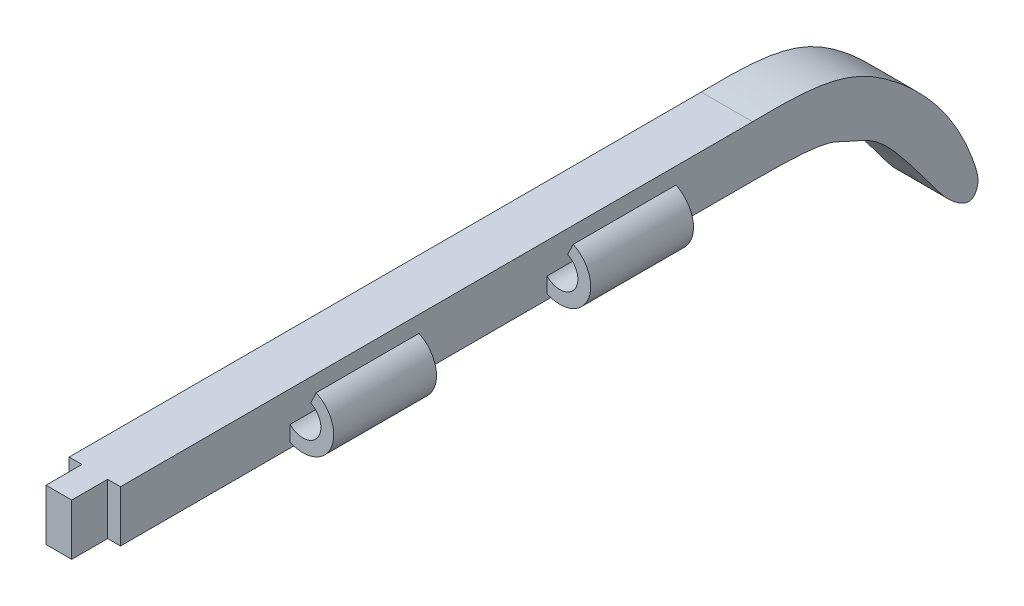
ISO-10303-21;
HEADER;
FILE_DESCRIPTION(('STEP AP214'),'2;1');
FILE_NAME('part.step','',(''),(''),'','','');
FILE_SCHEMA(('AUTOMOTIVE_DESIGN { 1 0 10303 214 1 1 1 1 }'));
ENDSEC;
DATA;
#1=APPLICATION_CONTEXT('core data for automotive mechanical design processes');
#2=APPLICATION_PROTOCOL_DEFINITION('international standard','automotive_design',2000,#1);
#3=PRODUCT_CONTEXT('',#1,'mechanical');
#4=PRODUCT('Part','Part','',(#3));
#5=PRODUCT_RELATED_PRODUCT_CATEGORY('part','',(#4));
#6=PRODUCT_DEFINITION_FORMATION('','',#4);
#7=PRODUCT_DEFINITION_CONTEXT('part definition',#1,'design');
#8=PRODUCT_DEFINITION('design','',#6,#7);
#9=PRODUCT_DEFINITION_SHAPE('','',#8);
#10=(LENGTH_UNIT() NAMED_UNIT(*) SI_UNIT(.MILLI.,.METRE.));
#11=(NAMED_UNIT(*) PLANE_ANGLE_UNIT() SI_UNIT($,.RADIAN.));
#12=(NAMED_UNIT(*) SI_UNIT($,.STERADIAN.) SOLID_ANGLE_UNIT());
#13=UNCERTAINTY_MEASURE_WITH_UNIT(LENGTH_MEASURE(1.E-05),#10,'distance_accuracy_value','');
#14=(GEOMETRIC_REPRESENTATION_CONTEXT(3) GLOBAL_UNCERTAINTY_ASSIGNED_CONTEXT((#13)) GLOBAL_UNIT_ASSIGNED_CONTEXT((#10,
#11,#12)) REPRESENTATION_CONTEXT('',''));
#15=CARTESIAN_POINT('',(0.,0.,0.));
#16=DIRECTION('',(0.,0.,1.));
#17=DIRECTION('',(1.,0.,0.));
#18=AXIS2_PLACEMENT_3D('',#15,#16,#17);
#19=CARTESIAN_POINT('',(10.,-6.42982879689128,-155.300887230622));
#20=DIRECTION('',(1.,0.,0.));
#21=DIRECTION('',(0.,0.,-1.));
#22=AXIS2_PLACEMENT_3D('',#19,#20,#21);
#23=PLANE('',#22);
#24=DIRECTION('',(0.,0.,1.));
#25=VECTOR('',#24,1.);
#26=CARTESIAN_POINT('',(10.,4.,-60.));
#27=LINE('',#26,#25);
#28=CARTESIAN_POINT('',(10.,4.,-60.));
#29=VERTEX_POINT('',#28);
#30=CARTESIAN_POINT('',(10.,4.,-40.));
#31=VERTEX_POINT('',#30);
#32=EDGE_CURVE('E269',#29,#31,#27,.T.);
#33=ORIENTED_EDGE('',*,*,#32,.F.);
#34=DIRECTION('',(0.,1.,0.));
#35=VECTOR('',#34,1.);
#36=CARTESIAN_POINT('',(10.,0.,-60.));
#37=LINE('',#36,#35);
#38=CARTESIAN_POINT('',(10.,0.999999999999999,-60.));
#39=VERTEX_POINT('',#38);
#40=EDGE_CURVE('E256',#39,#29,#37,.T.);
#41=ORIENTED_EDGE('',*,*,#40,.F.);
#42=DIRECTION('',(0.,0.,1.));
#43=VECTOR('',#42,1.);
#44=CARTESIAN_POINT('',(10.,0.999999999999999,-60.));
#45=LINE('',#44,#43);
#46=CARTESIAN_POINT('',(10.,0.999999999999999,-40.));
#47=VERTEX_POINT('',#46);
#48=EDGE_CURVE('E290',#39,#47,#45,.T.);
#49=ORIENTED_EDGE('',*,*,#48,.T.);
#50=DIRECTION('',(0.,1.,0.));
#51=VECTOR('',#50,1.);
#52=CARTESIAN_POINT('',(10.,0.,-40.));
#53=LINE('',#52,#51);
#54=EDGE_CURVE('E273',#47,#31,#53,.T.);
#55=ORIENTED_EDGE('',*,*,#54,.T.);
#56=EDGE_LOOP('',(#33,#41,#49,#55));
#57=FACE_BOUND('',#56,.T.);
#58=DIRECTION('',(0.,0.,-1.));
#59=VECTOR('',#58,1.);
#60=CARTESIAN_POINT('',(10.,0.999999999999999,-90.));
#61=LINE('',#60,#59);
#62=CARTESIAN_POINT('',(10.,0.999999999999999,-90.));
#63=VERTEX_POINT('',#62);
#64=CARTESIAN_POINT('',(10.,0.999999999999999,-110.));
#65=VERTEX_POINT('',#64);
#66=EDGE_CURVE('E243',#63,#65,#61,.T.);
#67=ORIENTED_EDGE('',*,*,#66,.F.);
#68=DIRECTION('',(0.,1.,0.));
#69=VECTOR('',#68,1.);
#70=CARTESIAN_POINT('',(10.,0.,-90.));
#71=LINE('',#70,#69);
#72=CARTESIAN_POINT('',(10.,4.,-90.));
#73=VERTEX_POINT('',#72);
#74=EDGE_CURVE('E222',#63,#73,#71,.T.);
#75=ORIENTED_EDGE('',*,*,#74,.T.);
#76=DIRECTION('',(0.,0.,-1.));
#77=VECTOR('',#76,1.);
#78=CARTESIAN_POINT('',(10.,4.,-90.));
#79=LINE('',#78,#77);
#80=CARTESIAN_POINT('',(10.,4.,-110.));
#81=VERTEX_POINT('',#80);
#82=EDGE_CURVE('E239',#73,#81,#79,.T.);
#83=ORIENTED_EDGE('',*,*,#82,.T.);
#84=DIRECTION('',(0.,1.,0.));
#85=VECTOR('',#84,1.);
#86=CARTESIAN_POINT('',(10.,0.,-110.));
#87=LINE('',#86,#85);
#88=EDGE_CURVE('E216',#65,#81,#87,.T.);
#89=ORIENTED_EDGE('',*,*,#88,.F.);
#90=EDGE_LOOP('',(#67,#75,#83,#89));
#91=FACE_BOUND('',#90,.T.);
#92=DIRECTION('',(0.,0.,-1.));
#93=VECTOR('',#92,1.);
#94=CARTESIAN_POINT('',(10.,9.99999999999996,0.));
#95=LINE('',#94,#93);
#96=CARTESIAN_POINT('',(10.,9.99999999999996,-7.));
#97=VERTEX_POINT('',#96);
#98=CARTESIAN_POINT('',(10.,9.99999999999996,-130.));
#99=VERTEX_POINT('',#98);
#100=EDGE_CURVE('E296',#97,#99,#95,.T.);
#101=ORIENTED_EDGE('',*,*,#100,.F.);
#102=DIRECTION('',(0.,1.,0.));
#103=VECTOR('',#102,1.);
#104=CARTESIAN_POINT('',(10.,0.,-7.));
#105=LINE('',#104,#103);
#106=CARTESIAN_POINT('',(10.,0.,-7.));
#107=VERTEX_POINT('',#106);
#108=EDGE_CURVE('E59',#107,#97,#105,.T.);
#109=ORIENTED_EDGE('',*,*,#108,.F.);
#110=DIRECTION('',(0.,0.,1.));
#111=VECTOR('',#110,1.);
#112=CARTESIAN_POINT('',(10.,0.,-130.));
#113=LINE('',#112,#111);
#114=CARTESIAN_POINT('',(10.,0.,-130.));
#115=VERTEX_POINT('',#114);
#116=EDGE_CURVE('E307',#115,#107,#113,.T.);
#117=ORIENTED_EDGE('',*,*,#116,.F.);
#118=CARTESIAN_POINT('',(10.,9.99999999999997,-130.));
#119=CARTESIAN_POINT('',(10.,10.295968590931,-143.257831062412));
#120=CARTESIAN_POINT('',(10.,8.41133936852432,-152.362580677432));
#121=CARTESIAN_POINT('',(10.,-5.77334435383178,-167.478605766022));
#122=CARTESIAN_POINT('',(10.,-16.2820946464498,-172.615930833704));
#123=CARTESIAN_POINT('',(10.,-21.8732348199775,-174.074786886858));
#124=CARTESIAN_POINT('',(10.,-25.2750778877369,-172.857902226209));
#125=CARTESIAN_POINT('',(10.,-23.155195651103,-168.561594529484));
#126=CARTESIAN_POINT('',(10.,-7.44852186325274,-157.06153808889));
#127=CARTESIAN_POINT('',(10.,-5.12655605678584,-154.600537823708));
#128=CARTESIAN_POINT('',(10.,-1.23947524203274,-145.232328072717));
#129=CARTESIAN_POINT('',(10.,0.,-144.477420142203));
#130=CARTESIAN_POINT('',(10.,0.,-130.));
#131=B_SPLINE_CURVE_WITH_KNOTS('',3,(#118,#119,#120,#121,#122,#123,#124,#125,#126,#127,#128,
#129,#130),.UNSPECIFIED.,.F.,.F.,(4,1,1,1,1,1,1,1,1,1,4),(0.,0.101519052300562,
0.157910706506036,0.210541639800686,0.223356201787652,0.228060175251646,0.254301241197406,
0.299209561547706,0.632235058404343,0.706476920960281,1.),.UNSPECIFIED.);
#132=EDGE_CURVE('E299',#99,#115,#131,.T.);
#133=ORIENTED_EDGE('',*,*,#132,.F.);
#134=EDGE_LOOP('',(#101,#109,#117,#133));
#135=FACE_BOUND('',#134,.T.);
#136=ADVANCED_FACE('F41',(#57,#91,#135),#23,.T.);
#137=CARTESIAN_POINT('',(10.,0.,0.));
#138=DIRECTION('',(0.,0.,1.));
#139=DIRECTION('',(1.,0.,0.));
#140=AXIS2_PLACEMENT_3D('',#137,#138,#139);
#141=PLANE('',#140);
#142=DIRECTION('',(0.,-1.,0.));
#143=VECTOR('',#142,1.);
#144=CARTESIAN_POINT('',(7.5,0.,0.));
#145=LINE('',#144,#143);
#146=CARTESIAN_POINT('',(7.5,9.99999999999996,0.));
#147=VERTEX_POINT('',#146);
#148=CARTESIAN_POINT('',(7.5,0.,0.));
#149=VERTEX_POINT('',#148);
#150=EDGE_CURVE('E174',#147,#149,#145,.T.);
#151=ORIENTED_EDGE('',*,*,#150,.F.);
#152=DIRECTION('',(-1.,0.,0.));
#153=VECTOR('',#152,1.);
#154=CARTESIAN_POINT('',(10.,9.99999999999996,0.));
#155=LINE('',#154,#153);
#156=CARTESIAN_POINT('',(2.5,9.99999999999996,0.));
#157=VERTEX_POINT('',#156);
#158=EDGE_CURVE('E45',#147,#157,#155,.T.);
#159=ORIENTED_EDGE('',*,*,#158,.T.);
#160=DIRECTION('',(0.,-1.,0.));
#161=VECTOR('',#160,1.);
#162=CARTESIAN_POINT('',(2.5,0.,0.));
#163=LINE('',#162,#161);
#164=CARTESIAN_POINT('',(2.5,0.,0.));
#165=VERTEX_POINT('',#164);
#166=EDGE_CURVE('E192',#157,#165,#163,.T.);
#167=ORIENTED_EDGE('',*,*,#166,.T.);
#168=DIRECTION('',(-1.,0.,0.));
#169=VECTOR('',#168,1.);
#170=CARTESIAN_POINT('',(10.,0.,0.));
#171=LINE('',#170,#169);
#172=EDGE_CURVE('E11',#149,#165,#171,.T.);
#173=ORIENTED_EDGE('',*,*,#172,.F.);
#174=EDGE_LOOP('',(#151,#159,#167,#173));
#175=FACE_BOUND('',#174,.T.);
#176=ADVANCED_FACE('F43',(#175),#141,.T.);
#177=CARTESIAN_POINT('',(10.,0.,-130.));
#178=DIRECTION('',(0.,-1.,0.));
#179=DIRECTION('',(0.,0.,-1.));
#180=AXIS2_PLACEMENT_3D('',#177,#178,#179);
#181=PLANE('',#180);
#182=DIRECTION('',(0.,0.,1.));
#183=VECTOR('',#182,1.);
#184=CARTESIAN_POINT('',(7.5,0.,-7.));
#185=LINE('',#184,#183);
#186=CARTESIAN_POINT('',(7.5,0.,-7.));
#187=VERTEX_POINT('',#186);
#188=EDGE_CURVE('E164',#187,#149,#185,.T.);
#189=ORIENTED_EDGE('',*,*,#188,.T.);
#190=ORIENTED_EDGE('',*,*,#172,.T.);
#191=DIRECTION('',(0.,0.,1.));
#192=VECTOR('',#191,1.);
#193=CARTESIAN_POINT('',(2.5,0.,-7.));
#194=LINE('',#193,#192);
#195=CARTESIAN_POINT('',(2.5,0.,-7.));
#196=VERTEX_POINT('',#195);
#197=EDGE_CURVE('E206',#196,#165,#194,.T.);
#198=ORIENTED_EDGE('',*,*,#197,.F.);
#199=DIRECTION('',(1.,0.,0.));
#200=VECTOR('',#199,1.);
#201=CARTESIAN_POINT('',(0.,0.,-7.));
#202=LINE('',#201,#200);
#203=CARTESIAN_POINT('',(0.,0.,-7.));
#204=VERTEX_POINT('',#203);
#205=EDGE_CURVE('E198',#204,#196,#202,.T.);
#206=ORIENTED_EDGE('',*,*,#205,.F.);
#207=DIRECTION('',(0.,0.,1.));
#208=VECTOR('',#207,1.);
#209=CARTESIAN_POINT('',(0.,0.,-130.));
#210=LINE('',#209,#208);
#211=CARTESIAN_POINT('',(0.,0.,-130.));
#212=VERTEX_POINT('',#211);
#213=EDGE_CURVE('E300',#212,#204,#210,.T.);
#214=ORIENTED_EDGE('',*,*,#213,.F.);
#215=DIRECTION('',(-1.,0.,0.));
#216=VECTOR('',#215,1.);
#217=CARTESIAN_POINT('',(10.,0.,-130.));
#218=LINE('',#217,#216);
#219=EDGE_CURVE('E51',#115,#212,#218,.T.);
#220=ORIENTED_EDGE('',*,*,#219,.F.);
#221=ORIENTED_EDGE('',*,*,#116,.T.);
#222=DIRECTION('',(1.,0.,0.));
#223=VECTOR('',#222,1.);
#224=CARTESIAN_POINT('',(0.,0.,-7.));
#225=LINE('',#224,#223);
#226=EDGE_CURVE('E167',#187,#107,#225,.T.);
#227=ORIENTED_EDGE('',*,*,#226,.F.);
#228=EDGE_LOOP('',(#189,#190,#198,#206,#214,#220,#221,#227));
#229=FACE_BOUND('',#228,.T.);
#230=ADVANCED_FACE('F319',(#229),#181,.T.);
#231=CARTESIAN_POINT('',(10.,9.99999999999996,0.));
#232=DIRECTION('',(0.,1.,0.));
#233=DIRECTION('',(0.,0.,1.));
#234=AXIS2_PLACEMENT_3D('',#231,#232,#233);
#235=PLANE('',#234);
#236=DIRECTION('',(0.,0.,1.));
#237=VECTOR('',#236,1.);
#238=CARTESIAN_POINT('',(7.5,9.99999999999996,-7.));
#239=LINE('',#238,#237);
#240=CARTESIAN_POINT('',(7.5,9.99999999999996,-7.));
#241=VERTEX_POINT('',#240);
#242=EDGE_CURVE('E161',#241,#147,#239,.T.);
#243=ORIENTED_EDGE('',*,*,#242,.F.);
#244=DIRECTION('',(-1.,0.,0.));
#245=VECTOR('',#244,1.);
#246=CARTESIAN_POINT('',(0.,9.99999999999996,-7.));
#247=LINE('',#246,#245);
#248=EDGE_CURVE('E168',#97,#241,#247,.T.);
#249=ORIENTED_EDGE('',*,*,#248,.F.);
#250=ORIENTED_EDGE('',*,*,#100,.T.);
#251=DIRECTION('',(-1.,0.,0.));
#252=VECTOR('',#251,1.);
#253=CARTESIAN_POINT('',(10.,9.99999999999996,-130.));
#254=LINE('',#253,#252);
#255=CARTESIAN_POINT('',(0.,9.99999999999996,-130.));
#256=VERTEX_POINT('',#255);
#257=EDGE_CURVE('E513',#99,#256,#254,.T.);
#258=ORIENTED_EDGE('',*,*,#257,.T.);
#259=DIRECTION('',(0.,0.,-1.));
#260=VECTOR('',#259,1.);
#261=CARTESIAN_POINT('',(0.,9.99999999999996,0.));
#262=LINE('',#261,#260);
#263=CARTESIAN_POINT('',(0.,9.99999999999996,-7.00000000000001));
#264=VERTEX_POINT('',#263);
#265=EDGE_CURVE('E286',#264,#256,#262,.T.);
#266=ORIENTED_EDGE('',*,*,#265,.F.);
#267=DIRECTION('',(-1.,0.,0.));
#268=VECTOR('',#267,1.);
#269=CARTESIAN_POINT('',(0.,9.99999999999996,-7.));
#270=LINE('',#269,#268);
#271=CARTESIAN_POINT('',(2.5,9.99999999999996,-7.));
#272=VERTEX_POINT('',#271);
#273=EDGE_CURVE('E67',#272,#264,#270,.T.);
#274=ORIENTED_EDGE('',*,*,#273,.F.);
#275=DIRECTION('',(0.,0.,1.));
#276=VECTOR('',#275,1.);
#277=CARTESIAN_POINT('',(2.5,9.99999999999996,-7.));
#278=LINE('',#277,#276);
#279=EDGE_CURVE('E202',#272,#157,#278,.T.);
#280=ORIENTED_EDGE('',*,*,#279,.T.);
#281=ORIENTED_EDGE('',*,*,#158,.F.);
#282=EDGE_LOOP('',(#243,#249,#250,#258,#266,#274,#280,#281));
#283=FACE_BOUND('',#282,.T.);
#284=ADVANCED_FACE('F177',(#283),#235,.T.);
#285=CARTESIAN_POINT('',(0.,-6.42982879689128,-155.300887230622));
#286=DIRECTION('',(1.,0.,0.));
#287=DIRECTION('',(0.,0.,-1.));
#288=AXIS2_PLACEMENT_3D('',#285,#286,#287);
#289=PLANE('',#288);
#290=DIRECTION('',(0.,-1.,0.));
#291=VECTOR('',#290,1.);
#292=CARTESIAN_POINT('',(0.,0.,-7.));
#293=LINE('',#292,#291);
#294=EDGE_CURVE('E195',#264,#204,#293,.T.);
#295=ORIENTED_EDGE('',*,*,#294,.F.);
#296=ORIENTED_EDGE('',*,*,#265,.T.);
#297=CARTESIAN_POINT('',(0.,9.99999999999997,-130.));
#298=CARTESIAN_POINT('',(0.,10.295968590931,-143.257831062412));
#299=CARTESIAN_POINT('',(0.,8.41133936852432,-152.362580677432));
#300=CARTESIAN_POINT('',(0.,-5.77334435383178,-167.478605766022));
#301=CARTESIAN_POINT('',(0.,-16.2820946464498,-172.615930833704));
#302=CARTESIAN_POINT('',(0.,-21.8732348199775,-174.074786886858));
#303=CARTESIAN_POINT('',(0.,-25.2750778877369,-172.857902226209));
#304=CARTESIAN_POINT('',(0.,-23.155195651103,-168.561594529484));
#305=CARTESIAN_POINT('',(0.,-7.44852186325274,-157.06153808889));
#306=CARTESIAN_POINT('',(0.,-5.12655605678584,-154.600537823708));
#307=CARTESIAN_POINT('',(0.,-1.23947524203274,-145.232328072717));
#308=CARTESIAN_POINT('',(0.,0.,-144.477420142203));
#309=CARTESIAN_POINT('',(0.,0.,-130.));
#310=B_SPLINE_CURVE_WITH_KNOTS('',3,(#297,#298,#299,#300,#301,#302,#303,#304,#305,#306,#307,
#308,#309),.UNSPECIFIED.,.F.,.F.,(4,1,1,1,1,1,1,1,1,1,4),(0.,0.101519052300562,
0.157910706506036,0.210541639800686,0.223356201787652,0.228060175251646,0.254301241197406,
0.299209561547706,0.632235058404343,0.706476920960281,1.),.UNSPECIFIED.);
#311=EDGE_CURVE('E517',#256,#212,#310,.T.);
#312=ORIENTED_EDGE('',*,*,#311,.T.);
#313=ORIENTED_EDGE('',*,*,#213,.T.);
#314=EDGE_LOOP('',(#295,#296,#312,#313));
#315=FACE_BOUND('',#314,.T.);
#316=ADVANCED_FACE('F317',(#315),#289,.F.);
#317=DIRECTION('',(-1.,0.,0.));
#318=VECTOR('',#317,1.);
#319=SURFACE_OF_LINEAR_EXTRUSION('',#131,#318);
#320=ORIENTED_EDGE('',*,*,#311,.F.);
#321=ORIENTED_EDGE('',*,*,#257,.F.);
#322=ORIENTED_EDGE('',*,*,#132,.T.);
#323=ORIENTED_EDGE('',*,*,#219,.T.);
#324=EDGE_LOOP('',(#320,#321,#322,#323));
#325=FACE_BOUND('',#324,.T.);
#326=ADVANCED_FACE('F313',(#325),#319,.T.);
#327=CARTESIAN_POINT('',(12.4913043214795,6.45833333333333,-60.));
#328=DIRECTION('',(0.,0.,1.));
#329=DIRECTION('',(1.,0.,0.));
#330=AXIS2_PLACEMENT_3D('',#327,#328,#329);
#331=CYLINDRICAL_SURFACE('',#330,3.5);
#332=CARTESIAN_POINT('',(12.4913043214795,6.45833333333333,-40.));
#333=DIRECTION('',(0.,0.,1.));
#334=DIRECTION('',(1.,0.,0.));
#335=AXIS2_PLACEMENT_3D('',#332,#333,#334);
#336=CIRCLE('',#335,3.5);
#337=CARTESIAN_POINT('',(14.,9.61647160605247,-40.));
#338=VERTEX_POINT('',#337);
#339=EDGE_CURVE('E242',#31,#338,#336,.T.);
#340=ORIENTED_EDGE('',*,*,#339,.T.);
#341=DIRECTION('',(0.,0.,1.));
#342=VECTOR('',#341,1.);
#343=CARTESIAN_POINT('',(14.,9.61647160605247,-60.));
#344=LINE('',#343,#342);
#345=CARTESIAN_POINT('',(14.,9.61647160605247,-60.));
#346=VERTEX_POINT('',#345);
#347=EDGE_CURVE('E283',#346,#338,#344,.T.);
#348=ORIENTED_EDGE('',*,*,#347,.F.);
#349=CARTESIAN_POINT('',(12.4913043214795,6.45833333333333,-60.));
#350=DIRECTION('',(0.,0.,1.));
#351=DIRECTION('',(1.,0.,0.));
#352=AXIS2_PLACEMENT_3D('',#349,#350,#351);
#353=CIRCLE('',#352,3.5);
#354=EDGE_CURVE('E253',#29,#346,#353,.T.);
#355=ORIENTED_EDGE('',*,*,#354,.F.);
#356=ORIENTED_EDGE('',*,*,#32,.T.);
#357=EDGE_LOOP('',(#340,#348,#355,#356));
#358=FACE_BOUND('',#357,.T.);
#359=ADVANCED_FACE('F316',(#358),#331,.F.);
#360=CARTESIAN_POINT('',(7.65831945453285,-3.65850778782892,-60.));
#361=DIRECTION('',(-0.902325220776897,0.431055908148728,0.));
#362=DIRECTION('',(-0.431055908148728,-0.902325220776897,0.));
#363=AXIS2_PLACEMENT_3D('',#360,#361,#362);
#364=PLANE('',#363);
#365=DIRECTION('',(-0.431055908148728,-0.902325220776897,0.));
#366=VECTOR('',#365,1.);
#367=CARTESIAN_POINT('',(7.65831945453285,-3.65850778782892,-40.));
#368=LINE('',#367,#366);
#369=CARTESIAN_POINT('',(15.0776397703718,11.8722846579947,-40.));
#370=VERTEX_POINT('',#369);
#371=EDGE_CURVE('E257',#370,#338,#368,.T.);
#372=ORIENTED_EDGE('',*,*,#371,.F.);
#373=DIRECTION('',(0.,0.,1.));
#374=VECTOR('',#373,1.);
#375=CARTESIAN_POINT('',(15.0776397703718,11.8722846579947,-60.));
#376=LINE('',#375,#374);
#377=CARTESIAN_POINT('',(15.0776397703718,11.8722846579947,-60.));
#378=VERTEX_POINT('',#377);
#379=EDGE_CURVE('E287',#378,#370,#376,.T.);
#380=ORIENTED_EDGE('',*,*,#379,.F.);
#381=DIRECTION('',(-0.431055908148728,-0.902325220776897,0.));
#382=VECTOR('',#381,1.);
#383=CARTESIAN_POINT('',(7.65831945453285,-3.65850778782892,-60.));
#384=LINE('',#383,#382);
#385=EDGE_CURVE('E265',#378,#346,#384,.T.);
#386=ORIENTED_EDGE('',*,*,#385,.T.);
#387=ORIENTED_EDGE('',*,*,#347,.T.);
#388=EDGE_LOOP('',(#372,#380,#386,#387));
#389=FACE_BOUND('',#388,.T.);
#390=ADVANCED_FACE('F339',(#389),#364,.T.);
#391=CARTESIAN_POINT('',(12.4913043214795,6.45833333333333,-60.));
#392=DIRECTION('',(0.,0.,1.));
#393=DIRECTION('',(1.,0.,0.));
#394=AXIS2_PLACEMENT_3D('',#391,#392,#393);
#395=CYLINDRICAL_SURFACE('',#394,6.);
#396=CARTESIAN_POINT('',(12.4913043214795,6.45833333333333,-40.));
#397=DIRECTION('',(0.,0.,1.));
#398=DIRECTION('',(1.,0.,0.));
#399=AXIS2_PLACEMENT_3D('',#396,#397,#398);
#400=CIRCLE('',#399,6.);
#401=EDGE_CURVE('E276',#47,#370,#400,.T.);
#402=ORIENTED_EDGE('',*,*,#401,.F.);
#403=ORIENTED_EDGE('',*,*,#48,.F.);
#404=CARTESIAN_POINT('',(12.4913043214795,6.45833333333333,-60.));
#405=DIRECTION('',(0.,0.,1.));
#406=DIRECTION('',(1.,0.,0.));
#407=AXIS2_PLACEMENT_3D('',#404,#405,#406);
#408=CIRCLE('',#407,6.);
#409=EDGE_CURVE('E261',#39,#378,#408,.T.);
#410=ORIENTED_EDGE('',*,*,#409,.T.);
#411=ORIENTED_EDGE('',*,*,#379,.T.);
#412=EDGE_LOOP('',(#402,#403,#410,#411));
#413=FACE_BOUND('',#412,.T.);
#414=ADVANCED_FACE('F341',(#413),#395,.T.);
#415=CARTESIAN_POINT('',(0.,0.,-60.));
#416=DIRECTION('',(0.,0.,1.));
#417=DIRECTION('',(1.,0.,0.));
#418=AXIS2_PLACEMENT_3D('',#415,#416,#417);
#419=PLANE('',#418);
#420=ORIENTED_EDGE('',*,*,#354,.T.);
#421=ORIENTED_EDGE('',*,*,#385,.F.);
#422=ORIENTED_EDGE('',*,*,#409,.F.);
#423=ORIENTED_EDGE('',*,*,#40,.T.);
#424=EDGE_LOOP('',(#420,#421,#422,#423));
#425=FACE_BOUND('',#424,.T.);
#426=ADVANCED_FACE('F344',(#425),#419,.F.);
#427=CARTESIAN_POINT('',(0.,0.,-40.));
#428=DIRECTION('',(0.,0.,1.));
#429=DIRECTION('',(1.,0.,0.));
#430=AXIS2_PLACEMENT_3D('',#427,#428,#429);
#431=PLANE('',#430);
#432=ORIENTED_EDGE('',*,*,#339,.F.);
#433=ORIENTED_EDGE('',*,*,#54,.F.);
#434=ORIENTED_EDGE('',*,*,#401,.T.);
#435=ORIENTED_EDGE('',*,*,#371,.T.);
#436=EDGE_LOOP('',(#432,#433,#434,#435));
#437=FACE_BOUND('',#436,.T.);
#438=ADVANCED_FACE('F349',(#437),#431,.T.);
#439=CARTESIAN_POINT('',(12.4913043214795,6.45833333333333,-90.));
#440=DIRECTION('',(0.,0.,-1.));
#441=DIRECTION('',(-1.,0.,0.));
#442=AXIS2_PLACEMENT_3D('',#439,#440,#441);
#443=CYLINDRICAL_SURFACE('',#442,3.5);
#444=CARTESIAN_POINT('',(12.4913043214795,6.45833333333333,-110.));
#445=DIRECTION('',(0.,0.,1.));
#446=DIRECTION('',(1.,0.,0.));
#447=AXIS2_PLACEMENT_3D('',#444,#445,#446);
#448=CIRCLE('',#447,3.5);
#449=CARTESIAN_POINT('',(14.,9.61647160605247,-110.));
#450=VERTEX_POINT('',#449);
#451=EDGE_CURVE('E184',#81,#450,#448,.T.);
#452=ORIENTED_EDGE('',*,*,#451,.F.);
#453=ORIENTED_EDGE('',*,*,#82,.F.);
#454=CARTESIAN_POINT('',(12.4913043214795,6.45833333333333,-90.));
#455=DIRECTION('',(0.,0.,1.));
#456=DIRECTION('',(1.,0.,0.));
#457=AXIS2_PLACEMENT_3D('',#454,#455,#456);
#458=CIRCLE('',#457,3.5);
#459=CARTESIAN_POINT('',(14.,9.61647160605247,-90.));
#460=VERTEX_POINT('',#459);
#461=EDGE_CURVE('E211',#73,#460,#458,.T.);
#462=ORIENTED_EDGE('',*,*,#461,.T.);
#463=DIRECTION('',(0.,0.,-1.));
#464=VECTOR('',#463,1.);
#465=CARTESIAN_POINT('',(14.,9.61647160605247,-90.));
#466=LINE('',#465,#464);
#467=EDGE_CURVE('E225',#460,#450,#466,.T.);
#468=ORIENTED_EDGE('',*,*,#467,.T.);
#469=EDGE_LOOP('',(#452,#453,#462,#468));
#470=FACE_BOUND('',#469,.T.);
#471=ADVANCED_FACE('F352',(#470),#443,.F.);
#472=CARTESIAN_POINT('',(12.4913043214795,6.45833333333333,-90.));
#473=DIRECTION('',(0.,0.,-1.));
#474=DIRECTION('',(-1.,0.,0.));
#475=AXIS2_PLACEMENT_3D('',#472,#473,#474);
#476=CYLINDRICAL_SURFACE('',#475,6.);
#477=CARTESIAN_POINT('',(12.4913043214795,6.45833333333333,-110.));
#478=DIRECTION('',(0.,0.,1.));
#479=DIRECTION('',(1.,0.,0.));
#480=AXIS2_PLACEMENT_3D('',#477,#478,#479);
#481=CIRCLE('',#480,6.);
#482=CARTESIAN_POINT('',(15.0776397703718,11.8722846579947,-110.));
#483=VERTEX_POINT('',#482);
#484=EDGE_CURVE('E233',#65,#483,#481,.T.);
#485=ORIENTED_EDGE('',*,*,#484,.T.);
#486=DIRECTION('',(0.,0.,-1.));
#487=VECTOR('',#486,1.);
#488=CARTESIAN_POINT('',(15.0776397703718,11.8722846579947,-90.));
#489=LINE('',#488,#487);
#490=CARTESIAN_POINT('',(15.0776397703718,11.8722846579947,-90.));
#491=VERTEX_POINT('',#490);
#492=EDGE_CURVE('E247',#491,#483,#489,.T.);
#493=ORIENTED_EDGE('',*,*,#492,.F.);
#494=CARTESIAN_POINT('',(12.4913043214795,6.45833333333333,-90.));
#495=DIRECTION('',(0.,0.,1.));
#496=DIRECTION('',(1.,0.,0.));
#497=AXIS2_PLACEMENT_3D('',#494,#495,#496);
#498=CIRCLE('',#497,6.);
#499=EDGE_CURVE('E219',#63,#491,#498,.T.);
#500=ORIENTED_EDGE('',*,*,#499,.F.);
#501=ORIENTED_EDGE('',*,*,#66,.T.);
#502=EDGE_LOOP('',(#485,#493,#500,#501));
#503=FACE_BOUND('',#502,.T.);
#504=ADVANCED_FACE('F359',(#503),#476,.T.);
#505=CARTESIAN_POINT('',(7.65831945453285,-3.65850778782892,-90.));
#506=DIRECTION('',(0.902325220776897,-0.431055908148728,0.));
#507=DIRECTION('',(0.431055908148728,0.902325220776897,0.));
#508=AXIS2_PLACEMENT_3D('',#505,#506,#507);
#509=PLANE('',#508);
#510=DIRECTION('',(-0.431055908148728,-0.902325220776897,0.));
#511=VECTOR('',#510,1.);
#512=CARTESIAN_POINT('',(7.65831945453285,-3.65850778782892,-110.));
#513=LINE('',#512,#511);
#514=EDGE_CURVE('E229',#483,#450,#513,.T.);
#515=ORIENTED_EDGE('',*,*,#514,.T.);
#516=ORIENTED_EDGE('',*,*,#467,.F.);
#517=DIRECTION('',(-0.431055908148728,-0.902325220776897,0.));
#518=VECTOR('',#517,1.);
#519=CARTESIAN_POINT('',(7.65831945453285,-3.65850778782892,-90.));
#520=LINE('',#519,#518);
#521=EDGE_CURVE('E215',#491,#460,#520,.T.);
#522=ORIENTED_EDGE('',*,*,#521,.F.);
#523=ORIENTED_EDGE('',*,*,#492,.T.);
#524=EDGE_LOOP('',(#515,#516,#522,#523));
#525=FACE_BOUND('',#524,.T.);
#526=ADVANCED_FACE('F361',(#525),#509,.F.);
#527=CARTESIAN_POINT('',(0.,0.,-90.));
#528=DIRECTION('',(0.,0.,-1.));
#529=DIRECTION('',(1.,0.,0.));
#530=AXIS2_PLACEMENT_3D('',#527,#528,#529);
#531=PLANE('',#530);
#532=ORIENTED_EDGE('',*,*,#461,.F.);
#533=ORIENTED_EDGE('',*,*,#74,.F.);
#534=ORIENTED_EDGE('',*,*,#499,.T.);
#535=ORIENTED_EDGE('',*,*,#521,.T.);
#536=EDGE_LOOP('',(#532,#533,#534,#535));
#537=FACE_BOUND('',#536,.T.);
#538=ADVANCED_FACE('F364',(#537),#531,.F.);
#539=CARTESIAN_POINT('',(0.,0.,-110.));
#540=DIRECTION('',(0.,0.,-1.));
#541=DIRECTION('',(1.,0.,0.));
#542=AXIS2_PLACEMENT_3D('',#539,#540,#541);
#543=PLANE('',#542);
#544=ORIENTED_EDGE('',*,*,#451,.T.);
#545=ORIENTED_EDGE('',*,*,#514,.F.);
#546=ORIENTED_EDGE('',*,*,#484,.F.);
#547=ORIENTED_EDGE('',*,*,#88,.T.);
#548=EDGE_LOOP('',(#544,#545,#546,#547));
#549=FACE_BOUND('',#548,.T.);
#550=ADVANCED_FACE('F369',(#549),#543,.T.);
#551=CARTESIAN_POINT('',(2.5,0.,-7.));
#552=DIRECTION('',(-1.,0.,0.));
#553=DIRECTION('',(0.,-1.,0.));
#554=AXIS2_PLACEMENT_3D('',#551,#552,#553);
#555=PLANE('',#554);
#556=ORIENTED_EDGE('',*,*,#166,.F.);
#557=ORIENTED_EDGE('',*,*,#279,.F.);
#558=DIRECTION('',(0.,-1.,0.));
#559=VECTOR('',#558,1.);
#560=CARTESIAN_POINT('',(2.5,0.,-7.));
#561=LINE('',#560,#559);
#562=EDGE_CURVE('E189',#272,#196,#561,.T.);
#563=ORIENTED_EDGE('',*,*,#562,.T.);
#564=ORIENTED_EDGE('',*,*,#197,.T.);
#565=EDGE_LOOP('',(#556,#557,#563,#564));
#566=FACE_BOUND('',#565,.T.);
#567=ADVANCED_FACE('F372',(#566),#555,.T.);
#568=CARTESIAN_POINT('',(0.,0.,-7.));
#569=DIRECTION('',(0.,0.,1.));
#570=DIRECTION('',(1.,0.,0.));
#571=AXIS2_PLACEMENT_3D('',#568,#569,#570);
#572=PLANE('',#571);
#573=ORIENTED_EDGE('',*,*,#562,.F.);
#574=ORIENTED_EDGE('',*,*,#273,.T.);
#575=ORIENTED_EDGE('',*,*,#294,.T.);
#576=ORIENTED_EDGE('',*,*,#205,.T.);
#577=EDGE_LOOP('',(#573,#574,#575,#576));
#578=FACE_BOUND('',#577,.T.);
#579=ADVANCED_FACE('F379',(#578),#572,.T.);
#580=CARTESIAN_POINT('',(7.5,0.,-7.));
#581=DIRECTION('',(-1.,0.,0.));
#582=DIRECTION('',(0.,-1.,0.));
#583=AXIS2_PLACEMENT_3D('',#580,#581,#582);
#584=PLANE('',#583);
#585=ORIENTED_EDGE('',*,*,#150,.T.);
#586=ORIENTED_EDGE('',*,*,#188,.F.);
#587=DIRECTION('',(0.,-1.,0.));
#588=VECTOR('',#587,1.);
#589=CARTESIAN_POINT('',(7.5,0.,-7.));
#590=LINE('',#589,#588);
#591=EDGE_CURVE('E158',#241,#187,#590,.T.);
#592=ORIENTED_EDGE('',*,*,#591,.F.);
#593=ORIENTED_EDGE('',*,*,#242,.T.);
#594=EDGE_LOOP('',(#585,#586,#592,#593));
#595=FACE_BOUND('',#594,.T.);
#596=ADVANCED_FACE('F159',(#595),#584,.F.);
#597=CARTESIAN_POINT('',(0.,0.,-7.));
#598=DIRECTION('',(0.,0.,1.));
#599=DIRECTION('',(1.,0.,0.));
#600=AXIS2_PLACEMENT_3D('',#597,#598,#599);
#601=PLANE('',#600);
#602=ORIENTED_EDGE('',*,*,#248,.T.);
#603=ORIENTED_EDGE('',*,*,#591,.T.);
#604=ORIENTED_EDGE('',*,*,#226,.T.);
#605=ORIENTED_EDGE('',*,*,#108,.T.);
#606=EDGE_LOOP('',(#602,#603,#604,#605));
#607=FACE_BOUND('',#606,.T.);
#608=ADVANCED_FACE('F170',(#607),#601,.T.);
#609=CLOSED_SHELL('',(#136,#176,#230,#284,#316,#326,#359,#390,#414,#426,#438,#471,#504,#526,
#538,#550,#567,#579,#596,#608));
#610=MANIFOLD_SOLID_BREP('B2',#609);
#611=ADVANCED_BREP_SHAPE_REPRESENTATION('',(#18,#610),#14);
#612=SHAPE_DEFINITION_REPRESENTATION(#9,#611);
ENDSEC;
END-ISO-10303-21;
